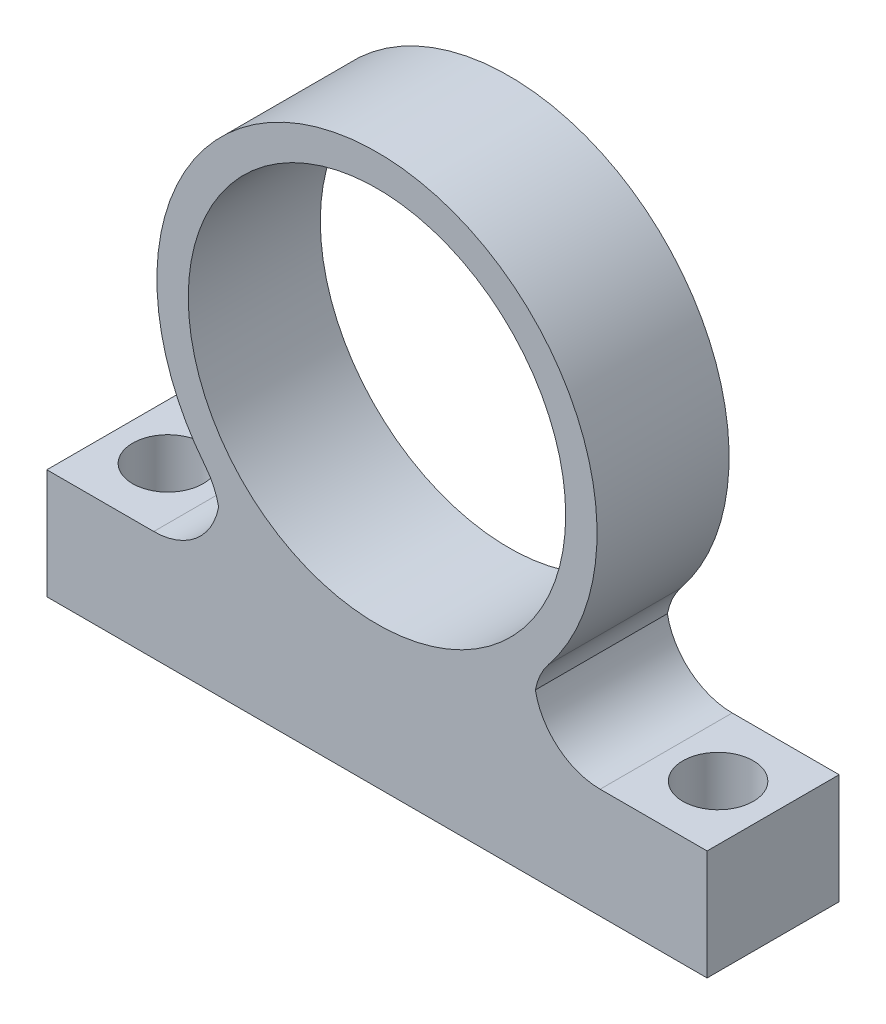
ISO-10303-21;
HEADER;
FILE_DESCRIPTION(('STEP AP214'),'2;1');
FILE_NAME('part.step','',(''),(''),'','','');
FILE_SCHEMA(('AUTOMOTIVE_DESIGN { 1 0 10303 214 1 1 1 1 }'));
ENDSEC;
DATA;
#1=APPLICATION_CONTEXT('core data for automotive mechanical design processes');
#2=APPLICATION_PROTOCOL_DEFINITION('international standard','automotive_design',2000,#1);
#3=PRODUCT_CONTEXT('',#1,'mechanical');
#4=PRODUCT('Part','Part','',(#3));
#5=PRODUCT_RELATED_PRODUCT_CATEGORY('part','',(#4));
#6=PRODUCT_DEFINITION_FORMATION('','',#4);
#7=PRODUCT_DEFINITION_CONTEXT('part definition',#1,'design');
#8=PRODUCT_DEFINITION('design','',#6,#7);
#9=PRODUCT_DEFINITION_SHAPE('','',#8);
#10=(LENGTH_UNIT() NAMED_UNIT(*) SI_UNIT(.MILLI.,.METRE.));
#11=(NAMED_UNIT(*) PLANE_ANGLE_UNIT() SI_UNIT($,.RADIAN.));
#12=(NAMED_UNIT(*) SI_UNIT($,.STERADIAN.) SOLID_ANGLE_UNIT());
#13=UNCERTAINTY_MEASURE_WITH_UNIT(LENGTH_MEASURE(1.E-05),#10,'distance_accuracy_value','');
#14=(GEOMETRIC_REPRESENTATION_CONTEXT(3) GLOBAL_UNCERTAINTY_ASSIGNED_CONTEXT((#13)) GLOBAL_UNIT_ASSIGNED_CONTEXT((#10,
#11,#12)) REPRESENTATION_CONTEXT('',''));
#15=CARTESIAN_POINT('',(0.,0.,0.));
#16=DIRECTION('',(0.,0.,1.));
#17=DIRECTION('',(1.,0.,0.));
#18=AXIS2_PLACEMENT_3D('',#15,#16,#17);
#19=CARTESIAN_POINT('',(0.,2.5,6.));
#20=DIRECTION('',(0.,1.,0.));
#21=DIRECTION('',(0.,0.,1.));
#22=AXIS2_PLACEMENT_3D('',#19,#20,#21);
#23=PLANE('',#22);
#24=CARTESIAN_POINT('',(12.5,2.5,3.));
#25=DIRECTION('',(0.,1.,0.));
#26=DIRECTION('',(0.,0.,1.));
#27=AXIS2_PLACEMENT_3D('',#24,#25,#26);
#28=CIRCLE('',#27,1.6);
#29=CARTESIAN_POINT('',(12.5,2.5,4.6));
#30=VERTEX_POINT('',#29);
#31=EDGE_CURVE('E240',#30,#30,#28,.T.);
#32=ORIENTED_EDGE('',*,*,#31,.F.);
#33=EDGE_LOOP('',(#32));
#34=FACE_BOUND('',#33,.T.);
#35=DIRECTION('',(1.,0.,0.));
#36=VECTOR('',#35,1.);
#37=CARTESIAN_POINT('',(0.,2.5,0.));
#38=LINE('',#37,#36);
#39=CARTESIAN_POINT('',(10.1414284285429,2.5,0.));
#40=VERTEX_POINT('',#39);
#41=CARTESIAN_POINT('',(15.,2.5,0.));
#42=VERTEX_POINT('',#41);
#43=EDGE_CURVE('E170',#40,#42,#38,.T.);
#44=ORIENTED_EDGE('',*,*,#43,.F.);
#45=DIRECTION('',(0.,0.,-1.));
#46=VECTOR('',#45,1.);
#47=CARTESIAN_POINT('',(10.1414284285429,2.5,6.));
#48=LINE('',#47,#46);
#49=CARTESIAN_POINT('',(10.1414284285429,2.5,6.));
#50=VERTEX_POINT('',#49);
#51=EDGE_CURVE('E210',#40,#50,#48,.F.);
#52=ORIENTED_EDGE('',*,*,#51,.T.);
#53=DIRECTION('',(1.,0.,0.));
#54=VECTOR('',#53,1.);
#55=CARTESIAN_POINT('',(0.,2.5,6.));
#56=LINE('',#55,#54);
#57=CARTESIAN_POINT('',(15.,2.5,6.));
#58=VERTEX_POINT('',#57);
#59=EDGE_CURVE('E151',#50,#58,#56,.T.);
#60=ORIENTED_EDGE('',*,*,#59,.T.);
#61=DIRECTION('',(0.,0.,-1.));
#62=VECTOR('',#61,1.);
#63=CARTESIAN_POINT('',(15.,2.5,6.));
#64=LINE('',#63,#62);
#65=EDGE_CURVE('E169',#58,#42,#64,.T.);
#66=ORIENTED_EDGE('',*,*,#65,.T.);
#67=EDGE_LOOP('',(#44,#52,#60,#66));
#68=FACE_BOUND('',#67,.T.);
#69=ADVANCED_FACE('F47',(#34,#68),#23,.T.);
#70=CARTESIAN_POINT('',(0.,12.5,6.));
#71=DIRECTION('',(0.,0.,-1.));
#72=DIRECTION('',(-1.,0.,0.));
#73=AXIS2_PLACEMENT_3D('',#70,#71,#72);
#74=CYLINDRICAL_SURFACE('',#73,10.);
#75=CARTESIAN_POINT('',(0.,12.5,0.));
#76=DIRECTION('',(0.,0.,1.));
#77=DIRECTION('',(1.,0.,0.));
#78=AXIS2_PLACEMENT_3D('',#75,#76,#77);
#79=CIRCLE('',#78,10.);
#80=CARTESIAN_POINT('',(7.80109879118681,6.2435746907564,0.));
#81=VERTEX_POINT('',#80);
#82=CARTESIAN_POINT('',(-7.80109879118681,6.2435746907564,0.));
#83=VERTEX_POINT('',#82);
#84=EDGE_CURVE('E173',#81,#83,#79,.T.);
#85=ORIENTED_EDGE('',*,*,#84,.T.);
#86=DIRECTION('',(0.,0.,-1.));
#87=VECTOR('',#86,1.);
#88=CARTESIAN_POINT('',(-7.80109879118681,6.2435746907564,6.));
#89=LINE('',#88,#87);
#90=CARTESIAN_POINT('',(-7.80109879118681,6.2435746907564,6.));
#91=VERTEX_POINT('',#90);
#92=EDGE_CURVE('E207',#83,#91,#89,.F.);
#93=ORIENTED_EDGE('',*,*,#92,.T.);
#94=CARTESIAN_POINT('',(0.,12.5,6.));
#95=DIRECTION('',(0.,0.,1.));
#96=DIRECTION('',(1.,0.,0.));
#97=AXIS2_PLACEMENT_3D('',#94,#95,#96);
#98=CIRCLE('',#97,10.);
#99=CARTESIAN_POINT('',(7.80109879118681,6.2435746907564,6.));
#100=VERTEX_POINT('',#99);
#101=EDGE_CURVE('E149',#100,#91,#98,.T.);
#102=ORIENTED_EDGE('',*,*,#101,.F.);
#103=DIRECTION('',(0.,0.,-1.));
#104=VECTOR('',#103,1.);
#105=CARTESIAN_POINT('',(7.80109879118681,6.2435746907564,6.));
#106=LINE('',#105,#104);
#107=EDGE_CURVE('E203',#100,#81,#106,.T.);
#108=ORIENTED_EDGE('',*,*,#107,.T.);
#109=EDGE_LOOP('',(#85,#93,#102,#108));
#110=FACE_BOUND('',#109,.T.);
#111=ADVANCED_FACE('F284',(#110),#74,.T.);
#112=CARTESIAN_POINT('',(-12.5,2.5,3.));
#113=DIRECTION('',(0.,1.,0.));
#114=DIRECTION('',(0.,0.,1.));
#115=AXIS2_PLACEMENT_3D('',#112,#113,#114);
#116=CIRCLE('',#115,1.6);
#117=CARTESIAN_POINT('',(-12.5,2.5,4.6));
#118=VERTEX_POINT('',#117);
#119=EDGE_CURVE('E250',#118,#118,#116,.T.);
#120=ORIENTED_EDGE('',*,*,#119,.F.);
#121=EDGE_LOOP('',(#120));
#122=FACE_BOUND('',#121,.T.);
#123=CARTESIAN_POINT('',(-15.,2.5,6.));
#124=VERTEX_POINT('',#123);
#125=CARTESIAN_POINT('',(-10.1414284285429,2.5,6.));
#126=VERTEX_POINT('',#125);
#127=EDGE_CURVE('E130',#124,#126,#56,.T.);
#128=ORIENTED_EDGE('',*,*,#127,.T.);
#129=DIRECTION('',(0.,0.,-1.));
#130=VECTOR('',#129,1.);
#131=CARTESIAN_POINT('',(-10.1414284285429,2.5,0.));
#132=LINE('',#131,#130);
#133=CARTESIAN_POINT('',(-10.1414284285429,2.5,0.));
#134=VERTEX_POINT('',#133);
#135=EDGE_CURVE('E139',#126,#134,#132,.T.);
#136=ORIENTED_EDGE('',*,*,#135,.T.);
#137=CARTESIAN_POINT('',(-15.,2.5,0.));
#138=VERTEX_POINT('',#137);
#139=EDGE_CURVE('E133',#138,#134,#38,.T.);
#140=ORIENTED_EDGE('',*,*,#139,.F.);
#141=DIRECTION('',(0.,0.,-1.));
#142=VECTOR('',#141,1.);
#143=CARTESIAN_POINT('',(-15.,2.5,6.));
#144=LINE('',#143,#142);
#145=EDGE_CURVE('E126',#124,#138,#144,.T.);
#146=ORIENTED_EDGE('',*,*,#145,.F.);
#147=EDGE_LOOP('',(#128,#136,#140,#146));
#148=FACE_BOUND('',#147,.T.);
#149=ADVANCED_FACE('F128',(#122,#148),#23,.T.);
#150=CARTESIAN_POINT('',(-15.,0.,6.));
#151=DIRECTION('',(-1.,0.,0.));
#152=DIRECTION('',(0.,0.,1.));
#153=AXIS2_PLACEMENT_3D('',#150,#151,#152);
#154=PLANE('',#153);
#155=DIRECTION('',(0.,1.,0.));
#156=VECTOR('',#155,1.);
#157=CARTESIAN_POINT('',(-15.,0.,0.));
#158=LINE('',#157,#156);
#159=CARTESIAN_POINT('',(-15.,-2.5,0.));
#160=VERTEX_POINT('',#159);
#161=EDGE_CURVE('E178',#160,#138,#158,.T.);
#162=ORIENTED_EDGE('',*,*,#161,.F.);
#163=DIRECTION('',(0.,0.,-1.));
#164=VECTOR('',#163,1.);
#165=CARTESIAN_POINT('',(-15.,-2.5,6.));
#166=LINE('',#165,#164);
#167=CARTESIAN_POINT('',(-15.,-2.5,6.));
#168=VERTEX_POINT('',#167);
#169=EDGE_CURVE('E140',#168,#160,#166,.T.);
#170=ORIENTED_EDGE('',*,*,#169,.F.);
#171=DIRECTION('',(0.,1.,0.));
#172=VECTOR('',#171,1.);
#173=CARTESIAN_POINT('',(-15.,0.,6.));
#174=LINE('',#173,#172);
#175=EDGE_CURVE('E145',#168,#124,#174,.T.);
#176=ORIENTED_EDGE('',*,*,#175,.T.);
#177=ORIENTED_EDGE('',*,*,#145,.T.);
#178=EDGE_LOOP('',(#162,#170,#176,#177));
#179=FACE_BOUND('',#178,.T.);
#180=ADVANCED_FACE('F152',(#179),#154,.T.);
#181=CARTESIAN_POINT('',(0.,-2.5,6.));
#182=DIRECTION('',(0.,1.,0.));
#183=DIRECTION('',(0.,0.,1.));
#184=AXIS2_PLACEMENT_3D('',#181,#182,#183);
#185=PLANE('',#184);
#186=CARTESIAN_POINT('',(-12.5,-2.5,3.));
#187=DIRECTION('',(0.,1.,0.));
#188=DIRECTION('',(0.,0.,1.));
#189=AXIS2_PLACEMENT_3D('',#186,#187,#188);
#190=CIRCLE('',#189,1.6);
#191=CARTESIAN_POINT('',(-12.5,-2.5,4.6));
#192=VERTEX_POINT('',#191);
#193=EDGE_CURVE('E51',#192,#192,#190,.T.);
#194=ORIENTED_EDGE('',*,*,#193,.T.);
#195=EDGE_LOOP('',(#194));
#196=FACE_BOUND('',#195,.T.);
#197=CARTESIAN_POINT('',(12.5,-2.5,3.));
#198=DIRECTION('',(0.,1.,0.));
#199=DIRECTION('',(0.,0.,1.));
#200=AXIS2_PLACEMENT_3D('',#197,#198,#199);
#201=CIRCLE('',#200,1.6);
#202=CARTESIAN_POINT('',(12.5,-2.5,4.6));
#203=VERTEX_POINT('',#202);
#204=EDGE_CURVE('E237',#203,#203,#201,.T.);
#205=ORIENTED_EDGE('',*,*,#204,.T.);
#206=EDGE_LOOP('',(#205));
#207=FACE_BOUND('',#206,.T.);
#208=DIRECTION('',(1.,0.,0.));
#209=VECTOR('',#208,1.);
#210=CARTESIAN_POINT('',(0.,-2.5,0.));
#211=LINE('',#210,#209);
#212=CARTESIAN_POINT('',(15.,-2.5,0.));
#213=VERTEX_POINT('',#212);
#214=EDGE_CURVE('E181',#160,#213,#211,.T.);
#215=ORIENTED_EDGE('',*,*,#214,.T.);
#216=DIRECTION('',(0.,0.,-1.));
#217=VECTOR('',#216,1.);
#218=CARTESIAN_POINT('',(15.,-2.5,6.));
#219=LINE('',#218,#217);
#220=CARTESIAN_POINT('',(15.,-2.5,6.));
#221=VERTEX_POINT('',#220);
#222=EDGE_CURVE('E195',#221,#213,#219,.T.);
#223=ORIENTED_EDGE('',*,*,#222,.F.);
#224=DIRECTION('',(1.,0.,0.));
#225=VECTOR('',#224,1.);
#226=CARTESIAN_POINT('',(0.,-2.5,6.));
#227=LINE('',#226,#225);
#228=EDGE_CURVE('E155',#168,#221,#227,.T.);
#229=ORIENTED_EDGE('',*,*,#228,.F.);
#230=ORIENTED_EDGE('',*,*,#169,.T.);
#231=EDGE_LOOP('',(#215,#223,#229,#230));
#232=FACE_BOUND('',#231,.T.);
#233=ADVANCED_FACE('F275',(#196,#207,#232),#185,.F.);
#234=CARTESIAN_POINT('',(15.,0.,6.));
#235=DIRECTION('',(-1.,0.,0.));
#236=DIRECTION('',(0.,0.,1.));
#237=AXIS2_PLACEMENT_3D('',#234,#235,#236);
#238=PLANE('',#237);
#239=DIRECTION('',(0.,1.,0.));
#240=VECTOR('',#239,1.);
#241=CARTESIAN_POINT('',(15.,0.,0.));
#242=LINE('',#241,#240);
#243=EDGE_CURVE('E184',#213,#42,#242,.T.);
#244=ORIENTED_EDGE('',*,*,#243,.T.);
#245=ORIENTED_EDGE('',*,*,#65,.F.);
#246=DIRECTION('',(0.,1.,0.));
#247=VECTOR('',#246,1.);
#248=CARTESIAN_POINT('',(15.,0.,6.));
#249=LINE('',#248,#247);
#250=EDGE_CURVE('E158',#221,#58,#249,.T.);
#251=ORIENTED_EDGE('',*,*,#250,.F.);
#252=ORIENTED_EDGE('',*,*,#222,.T.);
#253=EDGE_LOOP('',(#244,#245,#251,#252));
#254=FACE_BOUND('',#253,.T.);
#255=ADVANCED_FACE('F278',(#254),#238,.F.);
#256=CARTESIAN_POINT('',(0.,12.5,6.));
#257=DIRECTION('',(0.,0.,-1.));
#258=DIRECTION('',(-1.,0.,0.));
#259=AXIS2_PLACEMENT_3D('',#256,#257,#258);
#260=CYLINDRICAL_SURFACE('',#259,8.575);
#261=CARTESIAN_POINT('',(0.,12.5,6.));
#262=DIRECTION('',(0.,0.,1.));
#263=DIRECTION('',(1.,0.,0.));
#264=AXIS2_PLACEMENT_3D('',#261,#262,#263);
#265=CIRCLE('',#264,8.575);
#266=CARTESIAN_POINT('',(8.575,12.5,6.));
#267=VERTEX_POINT('',#266);
#268=EDGE_CURVE('E165',#267,#267,#265,.T.);
#269=ORIENTED_EDGE('',*,*,#268,.T.);
#270=EDGE_LOOP('',(#269));
#271=FACE_BOUND('',#270,.T.);
#272=CARTESIAN_POINT('',(0.,12.5,0.));
#273=DIRECTION('',(0.,0.,1.));
#274=DIRECTION('',(1.,0.,0.));
#275=AXIS2_PLACEMENT_3D('',#272,#273,#274);
#276=CIRCLE('',#275,8.575);
#277=CARTESIAN_POINT('',(8.575,12.5,0.));
#278=VERTEX_POINT('',#277);
#279=EDGE_CURVE('E188',#278,#278,#276,.T.);
#280=ORIENTED_EDGE('',*,*,#279,.F.);
#281=EDGE_LOOP('',(#280));
#282=FACE_BOUND('',#281,.T.);
#283=ADVANCED_FACE('F333',(#271,#282),#260,.F.);
#284=CARTESIAN_POINT('',(0.,0.,6.));
#285=DIRECTION('',(0.,0.,1.));
#286=DIRECTION('',(1.,0.,0.));
#287=AXIS2_PLACEMENT_3D('',#284,#285,#286);
#288=PLANE('',#287);
#289=ORIENTED_EDGE('',*,*,#59,.F.);
#290=CARTESIAN_POINT('',(10.1414284285429,5.5,6.));
#291=DIRECTION('',(0.,0.,1.));
#292=DIRECTION('',(1.,0.,0.));
#293=AXIS2_PLACEMENT_3D('',#290,#291,#292);
#294=CIRCLE('',#293,3.);
#295=CARTESIAN_POINT('',(7.19543491193889,4.93332354899166,6.));
#296=VERTEX_POINT('',#295);
#297=EDGE_CURVE('E11',#50,#296,#294,.F.);
#298=ORIENTED_EDGE('',*,*,#297,.T.);
#299=CARTESIAN_POINT('',(10.1414284285429,4.36664709798333,6.));
#300=DIRECTION('',(0.,0.,1.));
#301=DIRECTION('',(1.,0.,0.));
#302=AXIS2_PLACEMENT_3D('',#299,#300,#301);
#303=CIRCLE('',#302,3.);
#304=EDGE_CURVE('E226',#296,#100,#303,.F.);
#305=ORIENTED_EDGE('',*,*,#304,.T.);
#306=ORIENTED_EDGE('',*,*,#101,.T.);
#307=CARTESIAN_POINT('',(-10.1414284285429,4.36664709798332,6.));
#308=DIRECTION('',(0.,0.,1.));
#309=DIRECTION('',(1.,0.,0.));
#310=AXIS2_PLACEMENT_3D('',#307,#308,#309);
#311=CIRCLE('',#310,3.);
#312=CARTESIAN_POINT('',(-7.19543491193888,4.93332354899166,6.));
#313=VERTEX_POINT('',#312);
#314=EDGE_CURVE('E221',#91,#313,#311,.F.);
#315=ORIENTED_EDGE('',*,*,#314,.T.);
#316=CARTESIAN_POINT('',(-10.1414284285429,5.5,6.));
#317=DIRECTION('',(0.,0.,1.));
#318=DIRECTION('',(1.,0.,0.));
#319=AXIS2_PLACEMENT_3D('',#316,#317,#318);
#320=CIRCLE('',#319,3.);
#321=EDGE_CURVE('E147',#313,#126,#320,.F.);
#322=ORIENTED_EDGE('',*,*,#321,.T.);
#323=ORIENTED_EDGE('',*,*,#127,.F.);
#324=ORIENTED_EDGE('',*,*,#175,.F.);
#325=ORIENTED_EDGE('',*,*,#228,.T.);
#326=ORIENTED_EDGE('',*,*,#250,.T.);
#327=EDGE_LOOP('',(#289,#298,#305,#306,#315,#322,#323,#324,#325,#326));
#328=FACE_BOUND('',#327,.T.);
#329=ORIENTED_EDGE('',*,*,#268,.F.);
#330=EDGE_LOOP('',(#329));
#331=FACE_BOUND('',#330,.T.);
#332=ADVANCED_FACE('F143',(#328,#331),#288,.T.);
#333=CARTESIAN_POINT('',(0.,0.,0.));
#334=DIRECTION('',(0.,0.,1.));
#335=DIRECTION('',(1.,0.,0.));
#336=AXIS2_PLACEMENT_3D('',#333,#334,#335);
#337=PLANE('',#336);
#338=CARTESIAN_POINT('',(10.1414284285429,4.36664709798333,0.));
#339=DIRECTION('',(0.,0.,1.));
#340=DIRECTION('',(1.,0.,0.));
#341=AXIS2_PLACEMENT_3D('',#338,#339,#340);
#342=CIRCLE('',#341,3.);
#343=CARTESIAN_POINT('',(7.19543491193889,4.93332354899166,0.));
#344=VERTEX_POINT('',#343);
#345=EDGE_CURVE('E71',#81,#344,#342,.T.);
#346=ORIENTED_EDGE('',*,*,#345,.T.);
#347=CARTESIAN_POINT('',(10.1414284285429,5.5,0.));
#348=DIRECTION('',(0.,0.,1.));
#349=DIRECTION('',(1.,0.,0.));
#350=AXIS2_PLACEMENT_3D('',#347,#348,#349);
#351=CIRCLE('',#350,3.);
#352=EDGE_CURVE('E57',#344,#40,#351,.T.);
#353=ORIENTED_EDGE('',*,*,#352,.T.);
#354=ORIENTED_EDGE('',*,*,#43,.T.);
#355=ORIENTED_EDGE('',*,*,#243,.F.);
#356=ORIENTED_EDGE('',*,*,#214,.F.);
#357=ORIENTED_EDGE('',*,*,#161,.T.);
#358=ORIENTED_EDGE('',*,*,#139,.T.);
#359=CARTESIAN_POINT('',(-10.1414284285429,5.5,0.));
#360=DIRECTION('',(0.,0.,1.));
#361=DIRECTION('',(1.,0.,0.));
#362=AXIS2_PLACEMENT_3D('',#359,#360,#361);
#363=CIRCLE('',#362,3.);
#364=CARTESIAN_POINT('',(-7.19543491193888,4.93332354899166,0.));
#365=VERTEX_POINT('',#364);
#366=EDGE_CURVE('E213',#134,#365,#363,.T.);
#367=ORIENTED_EDGE('',*,*,#366,.T.);
#368=CARTESIAN_POINT('',(-10.1414284285429,4.36664709798332,0.));
#369=DIRECTION('',(0.,0.,1.));
#370=DIRECTION('',(1.,0.,0.));
#371=AXIS2_PLACEMENT_3D('',#368,#369,#370);
#372=CIRCLE('',#371,3.);
#373=EDGE_CURVE('E218',#365,#83,#372,.T.);
#374=ORIENTED_EDGE('',*,*,#373,.T.);
#375=ORIENTED_EDGE('',*,*,#84,.F.);
#376=EDGE_LOOP('',(#346,#353,#354,#355,#356,#357,#358,#367,#374,#375));
#377=FACE_BOUND('',#376,.T.);
#378=ORIENTED_EDGE('',*,*,#279,.T.);
#379=EDGE_LOOP('',(#378));
#380=FACE_BOUND('',#379,.T.);
#381=ADVANCED_FACE('F268',(#377,#380),#337,.F.);
#382=CARTESIAN_POINT('',(-10.1414284285429,4.36664709798332,6.));
#383=DIRECTION('',(0.,0.,-1.));
#384=DIRECTION('',(-1.,0.,0.));
#385=AXIS2_PLACEMENT_3D('',#382,#383,#384);
#386=CYLINDRICAL_SURFACE('',#385,3.);
#387=DIRECTION('',(0.,0.,-1.));
#388=VECTOR('',#387,1.);
#389=CARTESIAN_POINT('',(-7.19543491193888,4.93332354899166,3.));
#390=LINE('',#389,#388);
#391=EDGE_CURVE('E174',#313,#365,#390,.T.);
#392=ORIENTED_EDGE('',*,*,#391,.F.);
#393=ORIENTED_EDGE('',*,*,#314,.F.);
#394=ORIENTED_EDGE('',*,*,#92,.F.);
#395=ORIENTED_EDGE('',*,*,#373,.F.);
#396=EDGE_LOOP('',(#392,#393,#394,#395));
#397=FACE_BOUND('',#396,.T.);
#398=ADVANCED_FACE('F264',(#397),#386,.F.);
#399=CARTESIAN_POINT('',(-10.1414284285429,5.5,6.));
#400=DIRECTION('',(0.,0.,1.));
#401=DIRECTION('',(1.,0.,0.));
#402=AXIS2_PLACEMENT_3D('',#399,#400,#401);
#403=CYLINDRICAL_SURFACE('',#402,3.);
#404=ORIENTED_EDGE('',*,*,#321,.F.);
#405=ORIENTED_EDGE('',*,*,#391,.T.);
#406=ORIENTED_EDGE('',*,*,#366,.F.);
#407=ORIENTED_EDGE('',*,*,#135,.F.);
#408=EDGE_LOOP('',(#404,#405,#406,#407));
#409=FACE_BOUND('',#408,.T.);
#410=ADVANCED_FACE('F267',(#409),#403,.F.);
#411=CARTESIAN_POINT('',(10.1414284285429,5.5,6.));
#412=DIRECTION('',(0.,0.,-1.));
#413=DIRECTION('',(-1.,0.,0.));
#414=AXIS2_PLACEMENT_3D('',#411,#412,#413);
#415=CYLINDRICAL_SURFACE('',#414,3.);
#416=DIRECTION('',(0.,0.,-1.));
#417=VECTOR('',#416,1.);
#418=CARTESIAN_POINT('',(7.19543491193889,4.93332354899166,3.));
#419=LINE('',#418,#417);
#420=EDGE_CURVE('E234',#296,#344,#419,.T.);
#421=ORIENTED_EDGE('',*,*,#420,.F.);
#422=ORIENTED_EDGE('',*,*,#297,.F.);
#423=ORIENTED_EDGE('',*,*,#51,.F.);
#424=ORIENTED_EDGE('',*,*,#352,.F.);
#425=EDGE_LOOP('',(#421,#422,#423,#424));
#426=FACE_BOUND('',#425,.T.);
#427=ADVANCED_FACE('F49',(#426),#415,.F.);
#428=CARTESIAN_POINT('',(10.1414284285429,4.36664709798333,6.));
#429=DIRECTION('',(0.,0.,-1.));
#430=DIRECTION('',(-1.,0.,0.));
#431=AXIS2_PLACEMENT_3D('',#428,#429,#430);
#432=CYLINDRICAL_SURFACE('',#431,3.);
#433=ORIENTED_EDGE('',*,*,#304,.F.);
#434=ORIENTED_EDGE('',*,*,#420,.T.);
#435=ORIENTED_EDGE('',*,*,#345,.F.);
#436=ORIENTED_EDGE('',*,*,#107,.F.);
#437=EDGE_LOOP('',(#433,#434,#435,#436));
#438=FACE_BOUND('',#437,.T.);
#439=ADVANCED_FACE('F283',(#438),#432,.F.);
#440=CARTESIAN_POINT('',(12.5,-3.5,3.));
#441=DIRECTION('',(0.,1.,0.));
#442=DIRECTION('',(0.,0.,1.));
#443=AXIS2_PLACEMENT_3D('',#440,#441,#442);
#444=CYLINDRICAL_SURFACE('',#443,1.6);
#445=ORIENTED_EDGE('',*,*,#31,.T.);
#446=EDGE_LOOP('',(#445));
#447=FACE_BOUND('',#446,.T.);
#448=ORIENTED_EDGE('',*,*,#204,.F.);
#449=EDGE_LOOP('',(#448));
#450=FACE_BOUND('',#449,.T.);
#451=ADVANCED_FACE('F302',(#447,#450),#444,.F.);
#452=CARTESIAN_POINT('',(-12.5,-3.5,3.));
#453=DIRECTION('',(0.,1.,0.));
#454=DIRECTION('',(0.,0.,1.));
#455=AXIS2_PLACEMENT_3D('',#452,#453,#454);
#456=CYLINDRICAL_SURFACE('',#455,1.6);
#457=ORIENTED_EDGE('',*,*,#119,.T.);
#458=EDGE_LOOP('',(#457));
#459=FACE_BOUND('',#458,.T.);
#460=ORIENTED_EDGE('',*,*,#193,.F.);
#461=EDGE_LOOP('',(#460));
#462=FACE_BOUND('',#461,.T.);
#463=ADVANCED_FACE('F307',(#459,#462),#456,.F.);
#464=CLOSED_SHELL('',(#69,#111,#149,#180,#233,#255,#283,#332,#381,#398,#410,#427,#439,#451,#463));
#465=MANIFOLD_SOLID_BREP('B2',#464);
#466=ADVANCED_BREP_SHAPE_REPRESENTATION('',(#18,#465),#14);
#467=SHAPE_DEFINITION_REPRESENTATION(#9,#466);
ENDSEC;
END-ISO-10303-21;
